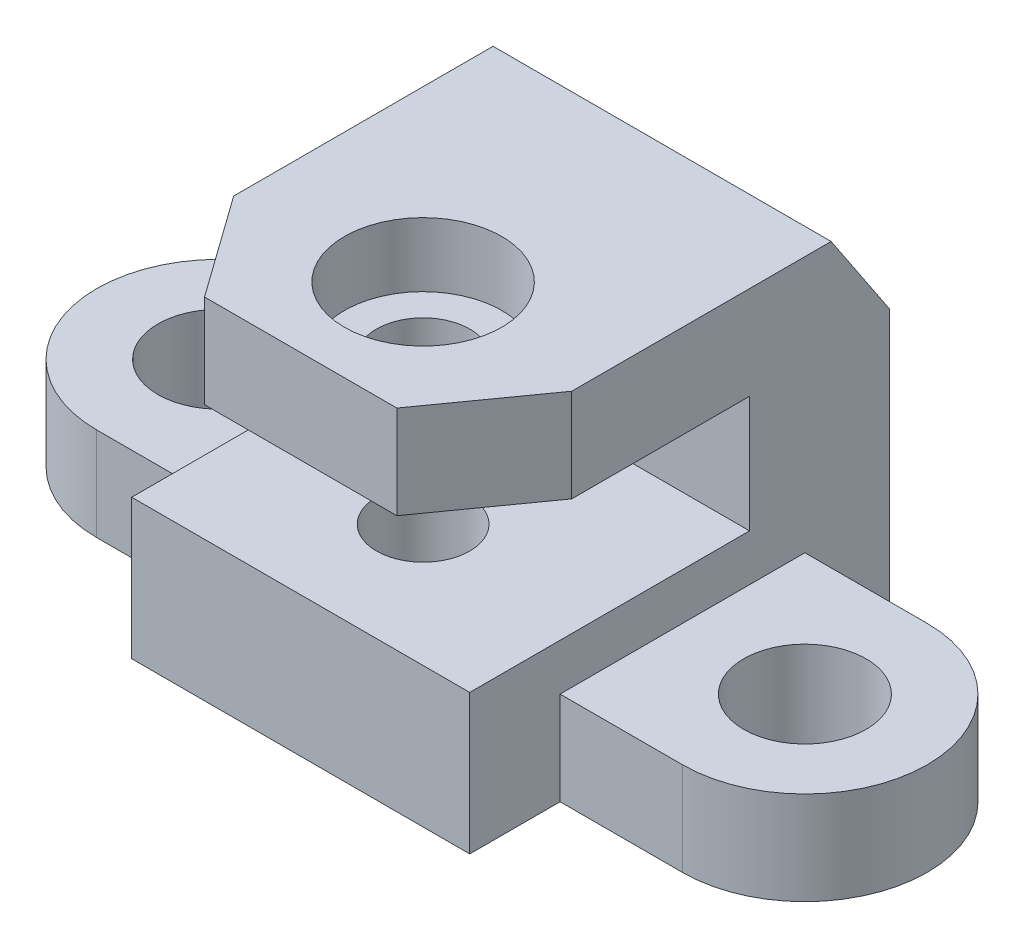
ISO-10303-21;
HEADER;
FILE_DESCRIPTION(('STEP AP214'),'2;1');
FILE_NAME('part.step','',(''),(''),'','','');
FILE_SCHEMA(('AUTOMOTIVE_DESIGN { 1 0 10303 214 1 1 1 1 }'));
ENDSEC;
DATA;
#1=APPLICATION_CONTEXT('core data for automotive mechanical design processes');
#2=APPLICATION_PROTOCOL_DEFINITION('international standard','automotive_design',2000,#1);
#3=PRODUCT_CONTEXT('',#1,'mechanical');
#4=PRODUCT('Part','Part','',(#3));
#5=PRODUCT_RELATED_PRODUCT_CATEGORY('part','',(#4));
#6=PRODUCT_DEFINITION_FORMATION('','',#4);
#7=PRODUCT_DEFINITION_CONTEXT('part definition',#1,'design');
#8=PRODUCT_DEFINITION('design','',#6,#7);
#9=PRODUCT_DEFINITION_SHAPE('','',#8);
#10=(LENGTH_UNIT() NAMED_UNIT(*) SI_UNIT(.MILLI.,.METRE.));
#11=(NAMED_UNIT(*) PLANE_ANGLE_UNIT() SI_UNIT($,.RADIAN.));
#12=(NAMED_UNIT(*) SI_UNIT($,.STERADIAN.) SOLID_ANGLE_UNIT());
#13=UNCERTAINTY_MEASURE_WITH_UNIT(LENGTH_MEASURE(1.E-05),#10,'distance_accuracy_value','');
#14=(GEOMETRIC_REPRESENTATION_CONTEXT(3) GLOBAL_UNCERTAINTY_ASSIGNED_CONTEXT((#13)) GLOBAL_UNIT_ASSIGNED_CONTEXT((#10,
#11,#12)) REPRESENTATION_CONTEXT('',''));
#15=CARTESIAN_POINT('',(0.,0.,0.));
#16=DIRECTION('',(0.,0.,1.));
#17=DIRECTION('',(1.,0.,0.));
#18=AXIS2_PLACEMENT_3D('',#15,#16,#17);
#19=CARTESIAN_POINT('',(0.,0.,-42.));
#20=DIRECTION('',(0.,1.,0.));
#21=DIRECTION('',(0.,0.,1.));
#22=AXIS2_PLACEMENT_3D('',#19,#20,#21);
#23=CYLINDRICAL_SURFACE('',#22,16.);
#24=CARTESIAN_POINT('',(0.,0.,-42.));
#25=DIRECTION('',(0.,1.,0.));
#26=DIRECTION('',(0.,0.,1.));
#27=AXIS2_PLACEMENT_3D('',#24,#25,#26);
#28=CIRCLE('',#27,16.);
#29=CARTESIAN_POINT('',(0.,0.,-26.));
#30=VERTEX_POINT('',#29);
#31=EDGE_CURVE('E229',#30,#30,#28,.T.);
#32=ORIENTED_EDGE('',*,*,#31,.F.);
#33=EDGE_LOOP('',(#32));
#34=FACE_BOUND('',#33,.T.);
#35=CARTESIAN_POINT('',(0.,48.,-42.));
#36=DIRECTION('',(0.,1.,0.));
#37=DIRECTION('',(0.,0.,1.));
#38=AXIS2_PLACEMENT_3D('',#35,#36,#37);
#39=CIRCLE('',#38,16.);
#40=CARTESIAN_POINT('',(0.,48.,-26.));
#41=VERTEX_POINT('',#40);
#42=EDGE_CURVE('E216',#41,#41,#39,.F.);
#43=ORIENTED_EDGE('',*,*,#42,.F.);
#44=EDGE_LOOP('',(#43));
#45=FACE_BOUND('',#44,.T.);
#46=ADVANCED_FACE('F39',(#34,#45),#23,.F.);
#47=CARTESIAN_POINT('',(0.,98.,-42.));
#48=DIRECTION('',(0.,1.,0.));
#49=DIRECTION('',(0.,0.,1.));
#50=AXIS2_PLACEMENT_3D('',#47,#48,#49);
#51=CIRCLE('',#50,16.);
#52=CARTESIAN_POINT('',(0.,98.,-26.));
#53=VERTEX_POINT('',#52);
#54=EDGE_CURVE('E43',#53,#53,#51,.F.);
#55=ORIENTED_EDGE('',*,*,#54,.F.);
#56=EDGE_LOOP('',(#55));
#57=FACE_BOUND('',#56,.T.);
#58=CARTESIAN_POINT('',(0.,88.,-42.));
#59=DIRECTION('',(0.,-1.,0.));
#60=DIRECTION('',(0.,0.,-1.));
#61=AXIS2_PLACEMENT_3D('',#58,#59,#60);
#62=CIRCLE('',#61,16.);
#63=CARTESIAN_POINT('',(0.,88.,-58.));
#64=VERTEX_POINT('',#63);
#65=EDGE_CURVE('E212',#64,#64,#62,.F.);
#66=ORIENTED_EDGE('',*,*,#65,.F.);
#67=EDGE_LOOP('',(#66));
#68=FACE_BOUND('',#67,.T.);
#69=ADVANCED_FACE('F490',(#57,#68),#23,.F.);
#70=CARTESIAN_POINT('',(58.,120.,0.));
#71=DIRECTION('',(-1.,0.,0.));
#72=DIRECTION('',(0.,0.,1.));
#73=AXIS2_PLACEMENT_3D('',#70,#71,#72);
#74=PLANE('',#73);
#75=DIRECTION('',(0.,0.,-1.));
#76=VECTOR('',#75,1.);
#77=CARTESIAN_POINT('',(58.,120.,0.));
#78=LINE('',#77,#76);
#79=CARTESIAN_POINT('',(58.,120.,-35.));
#80=VERTEX_POINT('',#79);
#81=CARTESIAN_POINT('',(58.,120.,-124.));
#82=VERTEX_POINT('',#81);
#83=EDGE_CURVE('E333',#80,#82,#78,.T.);
#84=ORIENTED_EDGE('',*,*,#83,.F.);
#85=DIRECTION('',(0.,1.,0.));
#86=VECTOR('',#85,1.);
#87=CARTESIAN_POINT('',(58.,88.,-35.));
#88=LINE('',#87,#86);
#89=CARTESIAN_POINT('',(58.,88.,-35.));
#90=VERTEX_POINT('',#89);
#91=EDGE_CURVE('E418',#90,#80,#88,.T.);
#92=ORIENTED_EDGE('',*,*,#91,.F.);
#93=DIRECTION('',(0.,0.,1.));
#94=VECTOR('',#93,1.);
#95=CARTESIAN_POINT('',(58.,88.,0.));
#96=LINE('',#95,#94);
#97=CARTESIAN_POINT('',(58.,88.,-96.));
#98=VERTEX_POINT('',#97);
#99=EDGE_CURVE('E195',#98,#90,#96,.T.);
#100=ORIENTED_EDGE('',*,*,#99,.F.);
#101=DIRECTION('',(0.,1.,0.));
#102=VECTOR('',#101,1.);
#103=CARTESIAN_POINT('',(58.,88.,-96.));
#104=LINE('',#103,#102);
#105=CARTESIAN_POINT('',(58.,48.,-96.));
#106=VERTEX_POINT('',#105);
#107=EDGE_CURVE('E201',#106,#98,#104,.T.);
#108=ORIENTED_EDGE('',*,*,#107,.F.);
#109=DIRECTION('',(0.,0.,-1.));
#110=VECTOR('',#109,1.);
#111=CARTESIAN_POINT('',(58.,48.,0.));
#112=LINE('',#111,#110);
#113=CARTESIAN_POINT('',(58.,48.,0.));
#114=VERTEX_POINT('',#113);
#115=EDGE_CURVE('E367',#114,#106,#112,.T.);
#116=ORIENTED_EDGE('',*,*,#115,.F.);
#117=DIRECTION('',(0.,-1.,0.));
#118=VECTOR('',#117,1.);
#119=CARTESIAN_POINT('',(58.,120.,0.));
#120=LINE('',#119,#118);
#121=CARTESIAN_POINT('',(58.,0.,0.));
#122=VERTEX_POINT('',#121);
#123=EDGE_CURVE('E49',#114,#122,#120,.T.);
#124=ORIENTED_EDGE('',*,*,#123,.T.);
#125=DIRECTION('',(0.,0.,-1.));
#126=VECTOR('',#125,1.);
#127=CARTESIAN_POINT('',(58.,0.,0.));
#128=LINE('',#127,#126);
#129=CARTESIAN_POINT('',(58.,0.,-31.));
#130=VERTEX_POINT('',#129);
#131=EDGE_CURVE('E346',#122,#130,#128,.T.);
#132=ORIENTED_EDGE('',*,*,#131,.T.);
#133=DIRECTION('',(0.,-1.,0.));
#134=VECTOR('',#133,1.);
#135=CARTESIAN_POINT('',(58.,32.,-31.));
#136=LINE('',#135,#134);
#137=CARTESIAN_POINT('',(58.,32.,-31.));
#138=VERTEX_POINT('',#137);
#139=EDGE_CURVE('E268',#138,#130,#136,.T.);
#140=ORIENTED_EDGE('',*,*,#139,.F.);
#141=DIRECTION('',(0.,0.,1.));
#142=VECTOR('',#141,1.);
#143=CARTESIAN_POINT('',(58.,32.,-115.));
#144=LINE('',#143,#142);
#145=CARTESIAN_POINT('',(58.,32.,-115.));
#146=VERTEX_POINT('',#145);
#147=EDGE_CURVE('E250',#146,#138,#144,.T.);
#148=ORIENTED_EDGE('',*,*,#147,.F.);
#149=DIRECTION('',(0.,-1.,0.));
#150=VECTOR('',#149,1.);
#151=CARTESIAN_POINT('',(58.,32.,-115.));
#152=LINE('',#151,#150);
#153=CARTESIAN_POINT('',(58.,0.,-115.));
#154=VERTEX_POINT('',#153);
#155=EDGE_CURVE('E271',#146,#154,#152,.T.);
#156=ORIENTED_EDGE('',*,*,#155,.T.);
#157=CARTESIAN_POINT('',(58.,0.,-144.));
#158=VERTEX_POINT('',#157);
#159=EDGE_CURVE('E345',#154,#158,#128,.T.);
#160=ORIENTED_EDGE('',*,*,#159,.T.);
#161=DIRECTION('',(0.,-1.,0.));
#162=VECTOR('',#161,1.);
#163=CARTESIAN_POINT('',(58.,120.,-144.));
#164=LINE('',#163,#162);
#165=CARTESIAN_POINT('',(58.,90.,-144.));
#166=VERTEX_POINT('',#165);
#167=EDGE_CURVE('E355',#166,#158,#164,.T.);
#168=ORIENTED_EDGE('',*,*,#167,.F.);
#169=DIRECTION('',(0.,-0.832050294337843,-0.554700196225229));
#170=VECTOR('',#169,1.);
#171=CARTESIAN_POINT('',(58.,120.,-124.));
#172=LINE('',#171,#170);
#173=EDGE_CURVE('E408',#82,#166,#172,.T.);
#174=ORIENTED_EDGE('',*,*,#173,.F.);
#175=EDGE_LOOP('',(#84,#92,#100,#108,#116,#124,#132,#140,#148,#156,#160,#168,#174));
#176=FACE_BOUND('',#175,.T.);
#177=ADVANCED_FACE('F363',(#176),#74,.F.);
#178=CARTESIAN_POINT('',(-58.,120.,0.));
#179=DIRECTION('',(1.,0.,0.));
#180=DIRECTION('',(0.,0.,-1.));
#181=AXIS2_PLACEMENT_3D('',#178,#179,#180);
#182=PLANE('',#181);
#183=DIRECTION('',(0.,0.,1.));
#184=VECTOR('',#183,1.);
#185=CARTESIAN_POINT('',(-58.,88.,0.));
#186=LINE('',#185,#184);
#187=CARTESIAN_POINT('',(-58.,88.,-96.));
#188=VERTEX_POINT('',#187);
#189=CARTESIAN_POINT('',(-58.,88.,-35.));
#190=VERTEX_POINT('',#189);
#191=EDGE_CURVE('E429',#188,#190,#186,.T.);
#192=ORIENTED_EDGE('',*,*,#191,.T.);
#193=DIRECTION('',(0.,1.,0.));
#194=VECTOR('',#193,1.);
#195=CARTESIAN_POINT('',(-58.,88.,-35.));
#196=LINE('',#195,#194);
#197=CARTESIAN_POINT('',(-58.,120.,-35.));
#198=VERTEX_POINT('',#197);
#199=EDGE_CURVE('E56',#190,#198,#196,.T.);
#200=ORIENTED_EDGE('',*,*,#199,.T.);
#201=DIRECTION('',(0.,0.,1.));
#202=VECTOR('',#201,1.);
#203=CARTESIAN_POINT('',(-58.,120.,0.));
#204=LINE('',#203,#202);
#205=CARTESIAN_POINT('',(-58.,120.,-124.));
#206=VERTEX_POINT('',#205);
#207=EDGE_CURVE('E326',#206,#198,#204,.T.);
#208=ORIENTED_EDGE('',*,*,#207,.F.);
#209=DIRECTION('',(0.,-0.832050294337843,-0.554700196225229));
#210=VECTOR('',#209,1.);
#211=CARTESIAN_POINT('',(-58.,120.,-124.));
#212=LINE('',#211,#210);
#213=CARTESIAN_POINT('',(-58.,90.,-144.));
#214=VERTEX_POINT('',#213);
#215=EDGE_CURVE('E211',#206,#214,#212,.T.);
#216=ORIENTED_EDGE('',*,*,#215,.T.);
#217=DIRECTION('',(0.,-1.,0.));
#218=VECTOR('',#217,1.);
#219=CARTESIAN_POINT('',(-58.,120.,-144.));
#220=LINE('',#219,#218);
#221=CARTESIAN_POINT('',(-58.,0.,-144.));
#222=VERTEX_POINT('',#221);
#223=EDGE_CURVE('E336',#214,#222,#220,.T.);
#224=ORIENTED_EDGE('',*,*,#223,.T.);
#225=DIRECTION('',(0.,0.,1.));
#226=VECTOR('',#225,1.);
#227=CARTESIAN_POINT('',(-58.,0.,0.));
#228=LINE('',#227,#226);
#229=CARTESIAN_POINT('',(-58.,0.,-114.));
#230=VERTEX_POINT('',#229);
#231=EDGE_CURVE('E337',#222,#230,#228,.T.);
#232=ORIENTED_EDGE('',*,*,#231,.T.);
#233=DIRECTION('',(0.,-1.,0.));
#234=VECTOR('',#233,1.);
#235=CARTESIAN_POINT('',(-58.,32.,-114.));
#236=LINE('',#235,#234);
#237=CARTESIAN_POINT('',(-58.,32.,-114.));
#238=VERTEX_POINT('',#237);
#239=EDGE_CURVE('E314',#238,#230,#236,.T.);
#240=ORIENTED_EDGE('',*,*,#239,.F.);
#241=DIRECTION('',(0.,0.,-1.));
#242=VECTOR('',#241,1.);
#243=CARTESIAN_POINT('',(-58.,32.,-114.));
#244=LINE('',#243,#242);
#245=CARTESIAN_POINT('',(-58.,32.,-30.));
#246=VERTEX_POINT('',#245);
#247=EDGE_CURVE('E296',#246,#238,#244,.T.);
#248=ORIENTED_EDGE('',*,*,#247,.F.);
#249=DIRECTION('',(0.,-1.,0.));
#250=VECTOR('',#249,1.);
#251=CARTESIAN_POINT('',(-58.,32.,-30.));
#252=LINE('',#251,#250);
#253=CARTESIAN_POINT('',(-58.,0.,-30.));
#254=VERTEX_POINT('',#253);
#255=EDGE_CURVE('E317',#246,#254,#252,.T.);
#256=ORIENTED_EDGE('',*,*,#255,.T.);
#257=CARTESIAN_POINT('',(-58.,0.,0.));
#258=VERTEX_POINT('',#257);
#259=EDGE_CURVE('E325',#254,#258,#228,.T.);
#260=ORIENTED_EDGE('',*,*,#259,.T.);
#261=DIRECTION('',(0.,-1.,0.));
#262=VECTOR('',#261,1.);
#263=CARTESIAN_POINT('',(-58.,120.,0.));
#264=LINE('',#263,#262);
#265=CARTESIAN_POINT('',(-58.,48.,0.));
#266=VERTEX_POINT('',#265);
#267=EDGE_CURVE('E11',#266,#258,#264,.T.);
#268=ORIENTED_EDGE('',*,*,#267,.F.);
#269=DIRECTION('',(0.,0.,-1.));
#270=VECTOR('',#269,1.);
#271=CARTESIAN_POINT('',(-58.,48.,0.));
#272=LINE('',#271,#270);
#273=CARTESIAN_POINT('',(-58.,48.,-96.));
#274=VERTEX_POINT('',#273);
#275=EDGE_CURVE('E421',#266,#274,#272,.T.);
#276=ORIENTED_EDGE('',*,*,#275,.T.);
#277=DIRECTION('',(0.,1.,0.));
#278=VECTOR('',#277,1.);
#279=CARTESIAN_POINT('',(-58.,88.,-96.));
#280=LINE('',#279,#278);
#281=EDGE_CURVE('E425',#274,#188,#280,.T.);
#282=ORIENTED_EDGE('',*,*,#281,.T.);
#283=EDGE_LOOP('',(#192,#200,#208,#216,#224,#232,#240,#248,#256,#260,#268,#276,#282));
#284=FACE_BOUND('',#283,.T.);
#285=ADVANCED_FACE('F41',(#284),#182,.F.);
#286=CARTESIAN_POINT('',(-58.,120.,0.));
#287=DIRECTION('',(0.,0.,-1.));
#288=DIRECTION('',(-1.,0.,0.));
#289=AXIS2_PLACEMENT_3D('',#286,#287,#288);
#290=PLANE('',#289);
#291=DIRECTION('',(-1.,0.,0.));
#292=VECTOR('',#291,1.);
#293=CARTESIAN_POINT('',(58.,48.,0.));
#294=LINE('',#293,#292);
#295=EDGE_CURVE('E207',#114,#266,#294,.T.);
#296=ORIENTED_EDGE('',*,*,#295,.T.);
#297=ORIENTED_EDGE('',*,*,#267,.T.);
#298=DIRECTION('',(1.,0.,0.));
#299=VECTOR('',#298,1.);
#300=CARTESIAN_POINT('',(-58.,0.,0.));
#301=LINE('',#300,#299);
#302=EDGE_CURVE('E341',#258,#122,#301,.T.);
#303=ORIENTED_EDGE('',*,*,#302,.T.);
#304=ORIENTED_EDGE('',*,*,#123,.F.);
#305=EDGE_LOOP('',(#296,#297,#303,#304));
#306=FACE_BOUND('',#305,.T.);
#307=ADVANCED_FACE('F370',(#306),#290,.F.);
#308=DIRECTION('',(1.,0.,0.));
#309=VECTOR('',#308,1.);
#310=CARTESIAN_POINT('',(-58.,120.,0.));
#311=LINE('',#310,#309);
#312=CARTESIAN_POINT('',(-33.,120.,0.));
#313=VERTEX_POINT('',#312);
#314=CARTESIAN_POINT('',(33.,120.,0.));
#315=VERTEX_POINT('',#314);
#316=EDGE_CURVE('E186',#313,#315,#311,.T.);
#317=ORIENTED_EDGE('',*,*,#316,.F.);
#318=DIRECTION('',(0.,1.,0.));
#319=VECTOR('',#318,1.);
#320=CARTESIAN_POINT('',(-33.,88.,0.));
#321=LINE('',#320,#319);
#322=CARTESIAN_POINT('',(-33.,88.,0.));
#323=VERTEX_POINT('',#322);
#324=EDGE_CURVE('E171',#323,#313,#321,.T.);
#325=ORIENTED_EDGE('',*,*,#324,.F.);
#326=DIRECTION('',(-1.,0.,0.));
#327=VECTOR('',#326,1.);
#328=CARTESIAN_POINT('',(58.,88.,0.));
#329=LINE('',#328,#327);
#330=CARTESIAN_POINT('',(33.,88.,0.));
#331=VERTEX_POINT('',#330);
#332=EDGE_CURVE('E184',#331,#323,#329,.T.);
#333=ORIENTED_EDGE('',*,*,#332,.F.);
#334=DIRECTION('',(0.,1.,0.));
#335=VECTOR('',#334,1.);
#336=CARTESIAN_POINT('',(33.,88.,0.));
#337=LINE('',#336,#335);
#338=EDGE_CURVE('E64',#331,#315,#337,.T.);
#339=ORIENTED_EDGE('',*,*,#338,.T.);
#340=EDGE_LOOP('',(#317,#325,#333,#339));
#341=FACE_BOUND('',#340,.T.);
#342=ADVANCED_FACE('F183',(#341),#290,.F.);
#343=CARTESIAN_POINT('',(-58.,120.,-144.));
#344=DIRECTION('',(0.,0.,1.));
#345=DIRECTION('',(1.,0.,0.));
#346=AXIS2_PLACEMENT_3D('',#343,#344,#345);
#347=PLANE('',#346);
#348=DIRECTION('',(-1.,0.,0.));
#349=VECTOR('',#348,1.);
#350=CARTESIAN_POINT('',(58.,90.,-144.));
#351=LINE('',#350,#349);
#352=EDGE_CURVE('E405',#166,#214,#351,.T.);
#353=ORIENTED_EDGE('',*,*,#352,.F.);
#354=ORIENTED_EDGE('',*,*,#167,.T.);
#355=DIRECTION('',(-1.,0.,0.));
#356=VECTOR('',#355,1.);
#357=CARTESIAN_POINT('',(-58.,0.,-144.));
#358=LINE('',#357,#356);
#359=EDGE_CURVE('E330',#158,#222,#358,.T.);
#360=ORIENTED_EDGE('',*,*,#359,.T.);
#361=ORIENTED_EDGE('',*,*,#223,.F.);
#362=EDGE_LOOP('',(#353,#354,#360,#361));
#363=FACE_BOUND('',#362,.T.);
#364=ADVANCED_FACE('F461',(#363),#347,.F.);
#365=CARTESIAN_POINT('',(0.,120.,0.));
#366=DIRECTION('',(0.,-1.,0.));
#367=DIRECTION('',(0.,0.,-1.));
#368=AXIS2_PLACEMENT_3D('',#365,#366,#367);
#369=PLANE('',#368);
#370=CARTESIAN_POINT('',(0.,120.,-42.));
#371=DIRECTION('',(0.,1.,0.));
#372=DIRECTION('',(0.,0.,1.));
#373=AXIS2_PLACEMENT_3D('',#370,#371,#372);
#374=CIRCLE('',#373,27.);
#375=CARTESIAN_POINT('',(0.,120.,-15.));
#376=VERTEX_POINT('',#375);
#377=EDGE_CURVE('E221',#376,#376,#374,.T.);
#378=ORIENTED_EDGE('',*,*,#377,.F.);
#379=EDGE_LOOP('',(#378));
#380=FACE_BOUND('',#379,.T.);
#381=ORIENTED_EDGE('',*,*,#207,.T.);
#382=DIRECTION('',(-0.581238193719097,0.,-0.813733471206735));
#383=VECTOR('',#382,1.);
#384=CARTESIAN_POINT('',(-58.,120.,-35.));
#385=LINE('',#384,#383);
#386=EDGE_CURVE('E178',#313,#198,#385,.T.);
#387=ORIENTED_EDGE('',*,*,#386,.F.);
#388=ORIENTED_EDGE('',*,*,#316,.T.);
#389=DIRECTION('',(-0.581238193719096,0.,0.813733471206735));
#390=VECTOR('',#389,1.);
#391=CARTESIAN_POINT('',(58.,120.,-35.));
#392=LINE('',#391,#390);
#393=EDGE_CURVE('E446',#80,#315,#392,.T.);
#394=ORIENTED_EDGE('',*,*,#393,.F.);
#395=ORIENTED_EDGE('',*,*,#83,.T.);
#396=DIRECTION('',(-1.,0.,0.));
#397=VECTOR('',#396,1.);
#398=CARTESIAN_POINT('',(58.,120.,-124.));
#399=LINE('',#398,#397);
#400=EDGE_CURVE('E217',#82,#206,#399,.T.);
#401=ORIENTED_EDGE('',*,*,#400,.T.);
#402=EDGE_LOOP('',(#381,#387,#388,#394,#395,#401));
#403=FACE_BOUND('',#402,.T.);
#404=ADVANCED_FACE('F455',(#380,#403),#369,.F.);
#405=CARTESIAN_POINT('',(0.,0.,0.));
#406=DIRECTION('',(0.,-1.,0.));
#407=DIRECTION('',(0.,0.,-1.));
#408=AXIS2_PLACEMENT_3D('',#405,#406,#407);
#409=PLANE('',#408);
#410=ORIENTED_EDGE('',*,*,#31,.T.);
#411=EDGE_LOOP('',(#410));
#412=FACE_BOUND('',#411,.T.);
#413=ORIENTED_EDGE('',*,*,#231,.F.);
#414=ORIENTED_EDGE('',*,*,#359,.F.);
#415=ORIENTED_EDGE('',*,*,#159,.F.);
#416=DIRECTION('',(-1.,0.,0.));
#417=VECTOR('',#416,1.);
#418=CARTESIAN_POINT('',(100.,0.,-115.));
#419=LINE('',#418,#417);
#420=CARTESIAN_POINT('',(100.,0.,-115.));
#421=VERTEX_POINT('',#420);
#422=EDGE_CURVE('E260',#421,#154,#419,.T.);
#423=ORIENTED_EDGE('',*,*,#422,.F.);
#424=CARTESIAN_POINT('',(100.,0.,-73.));
#425=DIRECTION('',(0.,1.,0.));
#426=DIRECTION('',(0.,0.,1.));
#427=AXIS2_PLACEMENT_3D('',#424,#425,#426);
#428=CIRCLE('',#427,42.);
#429=CARTESIAN_POINT('',(100.,0.,-31.));
#430=VERTEX_POINT('',#429);
#431=EDGE_CURVE('E238',#430,#421,#428,.T.);
#432=ORIENTED_EDGE('',*,*,#431,.F.);
#433=DIRECTION('',(1.,0.,0.));
#434=VECTOR('',#433,1.);
#435=CARTESIAN_POINT('',(58.,0.,-31.));
#436=LINE('',#435,#434);
#437=EDGE_CURVE('E247',#130,#430,#436,.T.);
#438=ORIENTED_EDGE('',*,*,#437,.F.);
#439=ORIENTED_EDGE('',*,*,#131,.F.);
#440=ORIENTED_EDGE('',*,*,#302,.F.);
#441=ORIENTED_EDGE('',*,*,#259,.F.);
#442=DIRECTION('',(1.,0.,0.));
#443=VECTOR('',#442,1.);
#444=CARTESIAN_POINT('',(-58.,0.,-30.));
#445=LINE('',#444,#443);
#446=CARTESIAN_POINT('',(-100.,0.,-30.));
#447=VERTEX_POINT('',#446);
#448=EDGE_CURVE('E306',#447,#254,#445,.T.);
#449=ORIENTED_EDGE('',*,*,#448,.F.);
#450=CARTESIAN_POINT('',(-100.,0.,-72.));
#451=DIRECTION('',(0.,1.,0.));
#452=DIRECTION('',(0.,0.,1.));
#453=AXIS2_PLACEMENT_3D('',#450,#451,#452);
#454=CIRCLE('',#453,42.);
#455=CARTESIAN_POINT('',(-100.,0.,-114.));
#456=VERTEX_POINT('',#455);
#457=EDGE_CURVE('E284',#456,#447,#454,.T.);
#458=ORIENTED_EDGE('',*,*,#457,.F.);
#459=DIRECTION('',(-1.,0.,0.));
#460=VECTOR('',#459,1.);
#461=CARTESIAN_POINT('',(-100.,0.,-114.));
#462=LINE('',#461,#460);
#463=EDGE_CURVE('E293',#230,#456,#462,.T.);
#464=ORIENTED_EDGE('',*,*,#463,.F.);
#465=EDGE_LOOP('',(#413,#414,#415,#423,#432,#438,#439,#440,#441,#449,#458,#464));
#466=FACE_BOUND('',#465,.T.);
#467=CARTESIAN_POINT('',(-100.,0.,-72.));
#468=DIRECTION('',(0.,1.,0.));
#469=DIRECTION('',(0.,0.,1.));
#470=AXIS2_PLACEMENT_3D('',#467,#468,#469);
#471=CIRCLE('',#470,21.);
#472=CARTESIAN_POINT('',(-100.,0.,-51.));
#473=VERTEX_POINT('',#472);
#474=EDGE_CURVE('E279',#473,#473,#471,.T.);
#475=ORIENTED_EDGE('',*,*,#474,.T.);
#476=EDGE_LOOP('',(#475));
#477=FACE_BOUND('',#476,.T.);
#478=CARTESIAN_POINT('',(100.,0.,-73.));
#479=DIRECTION('',(0.,1.,0.));
#480=DIRECTION('',(0.,0.,1.));
#481=AXIS2_PLACEMENT_3D('',#478,#479,#480);
#482=CIRCLE('',#481,21.);
#483=CARTESIAN_POINT('',(100.,0.,-52.));
#484=VERTEX_POINT('',#483);
#485=EDGE_CURVE('E233',#484,#484,#482,.T.);
#486=ORIENTED_EDGE('',*,*,#485,.T.);
#487=EDGE_LOOP('',(#486));
#488=FACE_BOUND('',#487,.T.);
#489=ADVANCED_FACE('F377',(#412,#466,#477,#488),#409,.T.);
#490=CARTESIAN_POINT('',(-100.,32.,-72.));
#491=DIRECTION('',(0.,1.,0.));
#492=DIRECTION('',(0.,0.,1.));
#493=AXIS2_PLACEMENT_3D('',#490,#491,#492);
#494=PLANE('',#493);
#495=CARTESIAN_POINT('',(-100.,32.,-72.));
#496=DIRECTION('',(0.,1.,0.));
#497=DIRECTION('',(0.,0.,1.));
#498=AXIS2_PLACEMENT_3D('',#495,#496,#497);
#499=CIRCLE('',#498,42.);
#500=CARTESIAN_POINT('',(-100.,32.,-114.));
#501=VERTEX_POINT('',#500);
#502=CARTESIAN_POINT('',(-100.,32.,-30.));
#503=VERTEX_POINT('',#502);
#504=EDGE_CURVE('E288',#501,#503,#499,.T.);
#505=ORIENTED_EDGE('',*,*,#504,.T.);
#506=DIRECTION('',(1.,0.,0.));
#507=VECTOR('',#506,1.);
#508=CARTESIAN_POINT('',(-58.,32.,-30.));
#509=LINE('',#508,#507);
#510=EDGE_CURVE('E292',#503,#246,#509,.T.);
#511=ORIENTED_EDGE('',*,*,#510,.T.);
#512=ORIENTED_EDGE('',*,*,#247,.T.);
#513=DIRECTION('',(-1.,0.,0.));
#514=VECTOR('',#513,1.);
#515=CARTESIAN_POINT('',(-100.,32.,-114.));
#516=LINE('',#515,#514);
#517=EDGE_CURVE('E299',#238,#501,#516,.T.);
#518=ORIENTED_EDGE('',*,*,#517,.T.);
#519=EDGE_LOOP('',(#505,#511,#512,#518));
#520=FACE_BOUND('',#519,.T.);
#521=CARTESIAN_POINT('',(-100.,32.,-72.));
#522=DIRECTION('',(0.,1.,0.));
#523=DIRECTION('',(0.,0.,1.));
#524=AXIS2_PLACEMENT_3D('',#521,#522,#523);
#525=CIRCLE('',#524,21.);
#526=CARTESIAN_POINT('',(-100.,32.,-51.));
#527=VERTEX_POINT('',#526);
#528=EDGE_CURVE('E280',#527,#527,#525,.T.);
#529=ORIENTED_EDGE('',*,*,#528,.F.);
#530=EDGE_LOOP('',(#529));
#531=FACE_BOUND('',#530,.T.);
#532=ADVANCED_FACE('F475',(#520,#531),#494,.T.);
#533=CARTESIAN_POINT('',(-100.,32.,-72.));
#534=DIRECTION('',(0.,-1.,0.));
#535=DIRECTION('',(0.,0.,-1.));
#536=AXIS2_PLACEMENT_3D('',#533,#534,#535);
#537=CYLINDRICAL_SURFACE('',#536,42.);
#538=ORIENTED_EDGE('',*,*,#457,.T.);
#539=DIRECTION('',(0.,-1.,0.));
#540=VECTOR('',#539,1.);
#541=CARTESIAN_POINT('',(-100.,32.,-30.));
#542=LINE('',#541,#540);
#543=EDGE_CURVE('E321',#503,#447,#542,.T.);
#544=ORIENTED_EDGE('',*,*,#543,.F.);
#545=ORIENTED_EDGE('',*,*,#504,.F.);
#546=DIRECTION('',(0.,-1.,0.));
#547=VECTOR('',#546,1.);
#548=CARTESIAN_POINT('',(-100.,32.,-114.));
#549=LINE('',#548,#547);
#550=EDGE_CURVE('E302',#501,#456,#549,.T.);
#551=ORIENTED_EDGE('',*,*,#550,.T.);
#552=EDGE_LOOP('',(#538,#544,#545,#551));
#553=FACE_BOUND('',#552,.T.);
#554=ADVANCED_FACE('F472',(#553),#537,.T.);
#555=CARTESIAN_POINT('',(-58.,32.,-30.));
#556=DIRECTION('',(0.,0.,-1.));
#557=DIRECTION('',(-1.,0.,0.));
#558=AXIS2_PLACEMENT_3D('',#555,#556,#557);
#559=PLANE('',#558);
#560=ORIENTED_EDGE('',*,*,#448,.T.);
#561=ORIENTED_EDGE('',*,*,#255,.F.);
#562=ORIENTED_EDGE('',*,*,#510,.F.);
#563=ORIENTED_EDGE('',*,*,#543,.T.);
#564=EDGE_LOOP('',(#560,#561,#562,#563));
#565=FACE_BOUND('',#564,.T.);
#566=ADVANCED_FACE('F479',(#565),#559,.F.);
#567=CARTESIAN_POINT('',(-100.,32.,-114.));
#568=DIRECTION('',(0.,0.,1.));
#569=DIRECTION('',(1.,0.,0.));
#570=AXIS2_PLACEMENT_3D('',#567,#568,#569);
#571=PLANE('',#570);
#572=ORIENTED_EDGE('',*,*,#463,.T.);
#573=ORIENTED_EDGE('',*,*,#550,.F.);
#574=ORIENTED_EDGE('',*,*,#517,.F.);
#575=ORIENTED_EDGE('',*,*,#239,.T.);
#576=EDGE_LOOP('',(#572,#573,#574,#575));
#577=FACE_BOUND('',#576,.T.);
#578=ADVANCED_FACE('F468',(#577),#571,.F.);
#579=CARTESIAN_POINT('',(-100.,32.,-72.));
#580=DIRECTION('',(0.,-1.,0.));
#581=DIRECTION('',(0.,0.,-1.));
#582=AXIS2_PLACEMENT_3D('',#579,#580,#581);
#583=CYLINDRICAL_SURFACE('',#582,21.);
#584=ORIENTED_EDGE('',*,*,#528,.T.);
#585=EDGE_LOOP('',(#584));
#586=FACE_BOUND('',#585,.T.);
#587=ORIENTED_EDGE('',*,*,#474,.F.);
#588=EDGE_LOOP('',(#587));
#589=FACE_BOUND('',#588,.T.);
#590=ADVANCED_FACE('F486',(#586,#589),#583,.F.);
#591=CARTESIAN_POINT('',(100.,32.,-73.));
#592=DIRECTION('',(0.,1.,0.));
#593=DIRECTION('',(0.,0.,1.));
#594=AXIS2_PLACEMENT_3D('',#591,#592,#593);
#595=PLANE('',#594);
#596=CARTESIAN_POINT('',(100.,32.,-73.));
#597=DIRECTION('',(0.,1.,0.));
#598=DIRECTION('',(0.,0.,1.));
#599=AXIS2_PLACEMENT_3D('',#596,#597,#598);
#600=CIRCLE('',#599,42.);
#601=CARTESIAN_POINT('',(100.,32.,-31.));
#602=VERTEX_POINT('',#601);
#603=CARTESIAN_POINT('',(100.,32.,-115.));
#604=VERTEX_POINT('',#603);
#605=EDGE_CURVE('E242',#602,#604,#600,.T.);
#606=ORIENTED_EDGE('',*,*,#605,.T.);
#607=DIRECTION('',(-1.,0.,0.));
#608=VECTOR('',#607,1.);
#609=CARTESIAN_POINT('',(100.,32.,-115.));
#610=LINE('',#609,#608);
#611=EDGE_CURVE('E246',#604,#146,#610,.T.);
#612=ORIENTED_EDGE('',*,*,#611,.T.);
#613=ORIENTED_EDGE('',*,*,#147,.T.);
#614=DIRECTION('',(1.,0.,0.));
#615=VECTOR('',#614,1.);
#616=CARTESIAN_POINT('',(58.,32.,-31.));
#617=LINE('',#616,#615);
#618=EDGE_CURVE('E253',#138,#602,#617,.T.);
#619=ORIENTED_EDGE('',*,*,#618,.T.);
#620=EDGE_LOOP('',(#606,#612,#613,#619));
#621=FACE_BOUND('',#620,.T.);
#622=CARTESIAN_POINT('',(100.,32.,-73.));
#623=DIRECTION('',(0.,1.,0.));
#624=DIRECTION('',(0.,0.,1.));
#625=AXIS2_PLACEMENT_3D('',#622,#623,#624);
#626=CIRCLE('',#625,21.);
#627=CARTESIAN_POINT('',(100.,32.,-52.));
#628=VERTEX_POINT('',#627);
#629=EDGE_CURVE('E234',#628,#628,#626,.T.);
#630=ORIENTED_EDGE('',*,*,#629,.F.);
#631=EDGE_LOOP('',(#630));
#632=FACE_BOUND('',#631,.T.);
#633=ADVANCED_FACE('F389',(#621,#632),#595,.T.);
#634=CARTESIAN_POINT('',(100.,32.,-73.));
#635=DIRECTION('',(0.,-1.,0.));
#636=DIRECTION('',(0.,0.,-1.));
#637=AXIS2_PLACEMENT_3D('',#634,#635,#636);
#638=CYLINDRICAL_SURFACE('',#637,42.);
#639=ORIENTED_EDGE('',*,*,#431,.T.);
#640=DIRECTION('',(0.,-1.,0.));
#641=VECTOR('',#640,1.);
#642=CARTESIAN_POINT('',(100.,32.,-115.));
#643=LINE('',#642,#641);
#644=EDGE_CURVE('E275',#604,#421,#643,.T.);
#645=ORIENTED_EDGE('',*,*,#644,.F.);
#646=ORIENTED_EDGE('',*,*,#605,.F.);
#647=DIRECTION('',(0.,-1.,0.));
#648=VECTOR('',#647,1.);
#649=CARTESIAN_POINT('',(100.,32.,-31.));
#650=LINE('',#649,#648);
#651=EDGE_CURVE('E256',#602,#430,#650,.T.);
#652=ORIENTED_EDGE('',*,*,#651,.T.);
#653=EDGE_LOOP('',(#639,#645,#646,#652));
#654=FACE_BOUND('',#653,.T.);
#655=ADVANCED_FACE('F386',(#654),#638,.T.);
#656=CARTESIAN_POINT('',(100.,32.,-115.));
#657=DIRECTION('',(0.,0.,1.));
#658=DIRECTION('',(1.,0.,0.));
#659=AXIS2_PLACEMENT_3D('',#656,#657,#658);
#660=PLANE('',#659);
#661=ORIENTED_EDGE('',*,*,#422,.T.);
#662=ORIENTED_EDGE('',*,*,#155,.F.);
#663=ORIENTED_EDGE('',*,*,#611,.F.);
#664=ORIENTED_EDGE('',*,*,#644,.T.);
#665=EDGE_LOOP('',(#661,#662,#663,#664));
#666=FACE_BOUND('',#665,.T.);
#667=ADVANCED_FACE('F512',(#666),#660,.F.);
#668=CARTESIAN_POINT('',(58.,32.,-31.));
#669=DIRECTION('',(0.,0.,-1.));
#670=DIRECTION('',(-1.,0.,0.));
#671=AXIS2_PLACEMENT_3D('',#668,#669,#670);
#672=PLANE('',#671);
#673=ORIENTED_EDGE('',*,*,#437,.T.);
#674=ORIENTED_EDGE('',*,*,#651,.F.);
#675=ORIENTED_EDGE('',*,*,#618,.F.);
#676=ORIENTED_EDGE('',*,*,#139,.T.);
#677=EDGE_LOOP('',(#673,#674,#675,#676));
#678=FACE_BOUND('',#677,.T.);
#679=ADVANCED_FACE('F382',(#678),#672,.F.);
#680=CARTESIAN_POINT('',(100.,32.,-73.));
#681=DIRECTION('',(0.,-1.,0.));
#682=DIRECTION('',(0.,0.,-1.));
#683=AXIS2_PLACEMENT_3D('',#680,#681,#682);
#684=CYLINDRICAL_SURFACE('',#683,21.);
#685=ORIENTED_EDGE('',*,*,#629,.T.);
#686=EDGE_LOOP('',(#685));
#687=FACE_BOUND('',#686,.T.);
#688=ORIENTED_EDGE('',*,*,#485,.F.);
#689=EDGE_LOOP('',(#688));
#690=FACE_BOUND('',#689,.T.);
#691=ADVANCED_FACE('F503',(#687,#690),#684,.F.);
#692=CARTESIAN_POINT('',(0.,98.,-42.));
#693=DIRECTION('',(0.,1.,0.));
#694=DIRECTION('',(0.,0.,1.));
#695=AXIS2_PLACEMENT_3D('',#692,#693,#694);
#696=PLANE('',#695);
#697=CARTESIAN_POINT('',(0.,98.,-42.));
#698=DIRECTION('',(0.,1.,0.));
#699=DIRECTION('',(0.,0.,1.));
#700=AXIS2_PLACEMENT_3D('',#697,#698,#699);
#701=CIRCLE('',#700,27.);
#702=CARTESIAN_POINT('',(0.,98.,-15.));
#703=VERTEX_POINT('',#702);
#704=EDGE_CURVE('E222',#703,#703,#701,.T.);
#705=ORIENTED_EDGE('',*,*,#704,.T.);
#706=EDGE_LOOP('',(#705));
#707=FACE_BOUND('',#706,.T.);
#708=ORIENTED_EDGE('',*,*,#54,.T.);
#709=EDGE_LOOP('',(#708));
#710=FACE_BOUND('',#709,.T.);
#711=ADVANCED_FACE('F506',(#707,#710),#696,.T.);
#712=CARTESIAN_POINT('',(0.,98.,-42.));
#713=DIRECTION('',(0.,1.,0.));
#714=DIRECTION('',(0.,0.,1.));
#715=AXIS2_PLACEMENT_3D('',#712,#713,#714);
#716=CYLINDRICAL_SURFACE('',#715,27.);
#717=ORIENTED_EDGE('',*,*,#704,.F.);
#718=EDGE_LOOP('',(#717));
#719=FACE_BOUND('',#718,.T.);
#720=ORIENTED_EDGE('',*,*,#377,.T.);
#721=EDGE_LOOP('',(#720));
#722=FACE_BOUND('',#721,.T.);
#723=ADVANCED_FACE('F501',(#719,#722),#716,.F.);
#724=CARTESIAN_POINT('',(58.,120.,-124.));
#725=DIRECTION('',(0.,0.554700196225229,-0.832050294337844));
#726=DIRECTION('',(0.,0.832050294337844,0.554700196225229));
#727=AXIS2_PLACEMENT_3D('',#724,#725,#726);
#728=PLANE('',#727);
#729=ORIENTED_EDGE('',*,*,#400,.F.);
#730=ORIENTED_EDGE('',*,*,#173,.T.);
#731=ORIENTED_EDGE('',*,*,#352,.T.);
#732=ORIENTED_EDGE('',*,*,#215,.F.);
#733=EDGE_LOOP('',(#729,#730,#731,#732));
#734=FACE_BOUND('',#733,.T.);
#735=ADVANCED_FACE('F458',(#734),#728,.T.);
#736=CARTESIAN_POINT('',(58.,48.,0.));
#737=DIRECTION('',(0.,1.,0.));
#738=DIRECTION('',(0.,0.,1.));
#739=AXIS2_PLACEMENT_3D('',#736,#737,#738);
#740=PLANE('',#739);
#741=ORIENTED_EDGE('',*,*,#295,.F.);
#742=ORIENTED_EDGE('',*,*,#115,.T.);
#743=DIRECTION('',(-1.,0.,0.));
#744=VECTOR('',#743,1.);
#745=CARTESIAN_POINT('',(58.,48.,-96.));
#746=LINE('',#745,#744);
#747=EDGE_CURVE('E199',#106,#274,#746,.T.);
#748=ORIENTED_EDGE('',*,*,#747,.T.);
#749=ORIENTED_EDGE('',*,*,#275,.F.);
#750=EDGE_LOOP('',(#741,#742,#748,#749));
#751=FACE_BOUND('',#750,.T.);
#752=ORIENTED_EDGE('',*,*,#42,.T.);
#753=EDGE_LOOP('',(#752));
#754=FACE_BOUND('',#753,.T.);
#755=ADVANCED_FACE('F576',(#751,#754),#740,.T.);
#756=CARTESIAN_POINT('',(58.,88.,0.));
#757=DIRECTION('',(0.,-1.,0.));
#758=DIRECTION('',(0.,0.,-1.));
#759=AXIS2_PLACEMENT_3D('',#756,#757,#758);
#760=PLANE('',#759);
#761=DIRECTION('',(-0.581238193719097,0.,-0.813733471206735));
#762=VECTOR('',#761,1.);
#763=CARTESIAN_POINT('',(-58.,88.,-35.));
#764=LINE('',#763,#762);
#765=EDGE_CURVE('E168',#323,#190,#764,.T.);
#766=ORIENTED_EDGE('',*,*,#765,.T.);
#767=ORIENTED_EDGE('',*,*,#191,.F.);
#768=DIRECTION('',(-1.,0.,0.));
#769=VECTOR('',#768,1.);
#770=CARTESIAN_POINT('',(58.,88.,-96.));
#771=LINE('',#770,#769);
#772=EDGE_CURVE('E194',#98,#188,#771,.T.);
#773=ORIENTED_EDGE('',*,*,#772,.F.);
#774=ORIENTED_EDGE('',*,*,#99,.T.);
#775=DIRECTION('',(-0.581238193719096,0.,0.813733471206735));
#776=VECTOR('',#775,1.);
#777=CARTESIAN_POINT('',(58.,88.,-35.));
#778=LINE('',#777,#776);
#779=EDGE_CURVE('E192',#90,#331,#778,.T.);
#780=ORIENTED_EDGE('',*,*,#779,.T.);
#781=ORIENTED_EDGE('',*,*,#332,.T.);
#782=EDGE_LOOP('',(#766,#767,#773,#774,#780,#781));
#783=FACE_BOUND('',#782,.T.);
#784=ORIENTED_EDGE('',*,*,#65,.T.);
#785=EDGE_LOOP('',(#784));
#786=FACE_BOUND('',#785,.T.);
#787=ADVANCED_FACE('F189',(#783,#786),#760,.T.);
#788=CARTESIAN_POINT('',(58.,88.,-96.));
#789=DIRECTION('',(0.,0.,1.));
#790=DIRECTION('',(1.,0.,0.));
#791=AXIS2_PLACEMENT_3D('',#788,#789,#790);
#792=PLANE('',#791);
#793=ORIENTED_EDGE('',*,*,#747,.F.);
#794=ORIENTED_EDGE('',*,*,#107,.T.);
#795=ORIENTED_EDGE('',*,*,#772,.T.);
#796=ORIENTED_EDGE('',*,*,#281,.F.);
#797=EDGE_LOOP('',(#793,#794,#795,#796));
#798=FACE_BOUND('',#797,.T.);
#799=ADVANCED_FACE('F437',(#798),#792,.T.);
#800=CARTESIAN_POINT('',(58.,88.,-35.));
#801=DIRECTION('',(-0.813733471206735,0.,-0.581238193719096));
#802=DIRECTION('',(-0.581238193719096,0.,0.813733471206735));
#803=AXIS2_PLACEMENT_3D('',#800,#801,#802);
#804=PLANE('',#803);
#805=ORIENTED_EDGE('',*,*,#393,.T.);
#806=ORIENTED_EDGE('',*,*,#338,.F.);
#807=ORIENTED_EDGE('',*,*,#779,.F.);
#808=ORIENTED_EDGE('',*,*,#91,.T.);
#809=EDGE_LOOP('',(#805,#806,#807,#808));
#810=FACE_BOUND('',#809,.T.);
#811=ADVANCED_FACE('F595',(#810),#804,.F.);
#812=CARTESIAN_POINT('',(-58.,88.,-35.));
#813=DIRECTION('',(0.813733471206735,0.,-0.581238193719097));
#814=DIRECTION('',(-0.581238193719097,0.,-0.813733471206735));
#815=AXIS2_PLACEMENT_3D('',#812,#813,#814);
#816=PLANE('',#815);
#817=ORIENTED_EDGE('',*,*,#386,.T.);
#818=ORIENTED_EDGE('',*,*,#199,.F.);
#819=ORIENTED_EDGE('',*,*,#765,.F.);
#820=ORIENTED_EDGE('',*,*,#324,.T.);
#821=EDGE_LOOP('',(#817,#818,#819,#820));
#822=FACE_BOUND('',#821,.T.);
#823=ADVANCED_FACE('F170',(#822),#816,.F.);
#824=CLOSED_SHELL('',(#46,#69,#177,#285,#307,#342,#364,#404,#489,#532,#554,#566,#578,#590,#633,
#655,#667,#679,#691,#711,#723,#735,#755,#787,#799,#811,#823));
#825=MANIFOLD_SOLID_BREP('B2',#824);
#826=ADVANCED_BREP_SHAPE_REPRESENTATION('',(#18,#825),#14);
#827=SHAPE_DEFINITION_REPRESENTATION(#9,#826);
ENDSEC;
END-ISO-10303-21;
